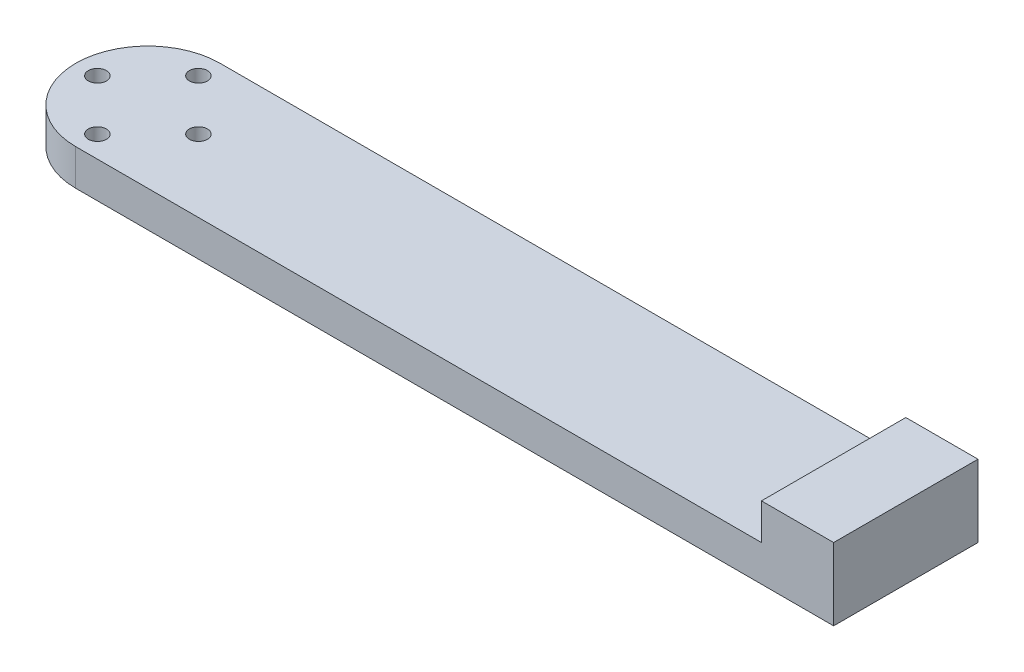
ISO-10303-21;
HEADER;
FILE_DESCRIPTION(('STEP AP214'),'2;1');
FILE_NAME('part.step','',(''),(''),'','','');
FILE_SCHEMA(('AUTOMOTIVE_DESIGN { 1 0 10303 214 1 1 1 1 }'));
ENDSEC;
DATA;
#1=APPLICATION_CONTEXT('core data for automotive mechanical design processes');
#2=APPLICATION_PROTOCOL_DEFINITION('international standard','automotive_design',2000,#1);
#3=PRODUCT_CONTEXT('',#1,'mechanical');
#4=PRODUCT('Part','Part','',(#3));
#5=PRODUCT_RELATED_PRODUCT_CATEGORY('part','',(#4));
#6=PRODUCT_DEFINITION_FORMATION('','',#4);
#7=PRODUCT_DEFINITION_CONTEXT('part definition',#1,'design');
#8=PRODUCT_DEFINITION('design','',#6,#7);
#9=PRODUCT_DEFINITION_SHAPE('','',#8);
#10=(LENGTH_UNIT() NAMED_UNIT(*) SI_UNIT(.MILLI.,.METRE.));
#11=(NAMED_UNIT(*) PLANE_ANGLE_UNIT() SI_UNIT($,.RADIAN.));
#12=(NAMED_UNIT(*) SI_UNIT($,.STERADIAN.) SOLID_ANGLE_UNIT());
#13=UNCERTAINTY_MEASURE_WITH_UNIT(LENGTH_MEASURE(1.E-05),#10,'distance_accuracy_value','');
#14=(GEOMETRIC_REPRESENTATION_CONTEXT(3) GLOBAL_UNCERTAINTY_ASSIGNED_CONTEXT((#13)) GLOBAL_UNIT_ASSIGNED_CONTEXT((#10,
#11,#12)) REPRESENTATION_CONTEXT('',''));
#15=CARTESIAN_POINT('',(0.,0.,0.));
#16=DIRECTION('',(0.,0.,1.));
#17=DIRECTION('',(1.,0.,0.));
#18=AXIS2_PLACEMENT_3D('',#15,#16,#17);
#19=CARTESIAN_POINT('',(0.,5.,0.));
#20=DIRECTION('',(0.,-1.,0.));
#21=DIRECTION('',(0.,0.,-1.));
#22=AXIS2_PLACEMENT_3D('',#19,#20,#21);
#23=CYLINDRICAL_SURFACE('',#22,10.);
#24=DIRECTION('',(0.,-1.,0.));
#25=VECTOR('',#24,1.);
#26=CARTESIAN_POINT('',(0.,111.88779163216,10.));
#27=LINE('',#26,#25);
#28=CARTESIAN_POINT('',(0.,5.,10.));
#29=VERTEX_POINT('',#28);
#30=CARTESIAN_POINT('',(0.,0.,10.));
#31=VERTEX_POINT('',#30);
#32=EDGE_CURVE('E138',#29,#31,#27,.T.);
#33=ORIENTED_EDGE('',*,*,#32,.F.);
#34=CARTESIAN_POINT('',(0.,5.,0.));
#35=DIRECTION('',(0.,1.,0.));
#36=DIRECTION('',(0.,0.,1.));
#37=AXIS2_PLACEMENT_3D('',#34,#35,#36);
#38=CIRCLE('',#37,10.);
#39=CARTESIAN_POINT('',(0.,5.,-10.));
#40=VERTEX_POINT('',#39);
#41=EDGE_CURVE('E122',#40,#29,#38,.T.);
#42=ORIENTED_EDGE('',*,*,#41,.F.);
#43=DIRECTION('',(0.,-1.,0.));
#44=VECTOR('',#43,1.);
#45=CARTESIAN_POINT('',(0.,111.88779163216,-10.));
#46=LINE('',#45,#44);
#47=CARTESIAN_POINT('',(0.,0.,-10.));
#48=VERTEX_POINT('',#47);
#49=EDGE_CURVE('E129',#40,#48,#46,.T.);
#50=ORIENTED_EDGE('',*,*,#49,.T.);
#51=CARTESIAN_POINT('',(0.,0.,0.));
#52=DIRECTION('',(0.,1.,0.));
#53=DIRECTION('',(0.,0.,1.));
#54=AXIS2_PLACEMENT_3D('',#51,#52,#53);
#55=CIRCLE('',#54,10.);
#56=EDGE_CURVE('E141',#48,#31,#55,.T.);
#57=ORIENTED_EDGE('',*,*,#56,.T.);
#58=EDGE_LOOP('',(#33,#42,#50,#57));
#59=FACE_BOUND('',#58,.T.);
#60=ADVANCED_FACE('F37',(#59),#23,.T.);
#61=CARTESIAN_POINT('',(0.,5.,0.));
#62=DIRECTION('',(0.,1.,0.));
#63=DIRECTION('',(0.,0.,1.));
#64=AXIS2_PLACEMENT_3D('',#61,#62,#63);
#65=PLANE('',#64);
#66=DIRECTION('',(0.,0.,1.));
#67=VECTOR('',#66,1.);
#68=CARTESIAN_POINT('',(95.,5.,0.));
#69=LINE('',#68,#67);
#70=CARTESIAN_POINT('',(95.,5.,-9.99999999999999));
#71=VERTEX_POINT('',#70);
#72=CARTESIAN_POINT('',(95.,5.,9.99999999999999));
#73=VERTEX_POINT('',#72);
#74=EDGE_CURVE('E123',#71,#73,#69,.T.);
#75=ORIENTED_EDGE('',*,*,#74,.F.);
#76=DIRECTION('',(-1.,0.,0.));
#77=VECTOR('',#76,1.);
#78=CARTESIAN_POINT('',(0.,5.,-10.));
#79=LINE('',#78,#77);
#80=EDGE_CURVE('E117',#71,#40,#79,.T.);
#81=ORIENTED_EDGE('',*,*,#80,.T.);
#82=ORIENTED_EDGE('',*,*,#41,.T.);
#83=DIRECTION('',(1.,0.,0.));
#84=VECTOR('',#83,1.);
#85=CARTESIAN_POINT('',(105.,5.,9.99999999999999));
#86=LINE('',#85,#84);
#87=EDGE_CURVE('E61',#29,#73,#86,.T.);
#88=ORIENTED_EDGE('',*,*,#87,.T.);
#89=EDGE_LOOP('',(#75,#81,#82,#88));
#90=FACE_BOUND('',#89,.T.);
#91=CARTESIAN_POINT('',(3.95332173747447E-13,5.,7.));
#92=DIRECTION('',(0.,1.,0.));
#93=DIRECTION('',(0.,0.,1.));
#94=AXIS2_PLACEMENT_3D('',#91,#92,#93);
#95=CIRCLE('',#94,1.25000000000042);
#96=CARTESIAN_POINT('',(3.95332173747447E-13,5.,8.25000000000042));
#97=VERTEX_POINT('',#96);
#98=EDGE_CURVE('E155',#97,#97,#95,.T.);
#99=ORIENTED_EDGE('',*,*,#98,.F.);
#100=EDGE_LOOP('',(#99));
#101=FACE_BOUND('',#100,.T.);
#102=CARTESIAN_POINT('',(0.,5.,-7.));
#103=DIRECTION('',(0.,1.,0.));
#104=DIRECTION('',(0.,0.,1.));
#105=AXIS2_PLACEMENT_3D('',#102,#103,#104);
#106=CIRCLE('',#105,1.25);
#107=CARTESIAN_POINT('',(0.,5.,-5.75));
#108=VERTEX_POINT('',#107);
#109=EDGE_CURVE('E144',#108,#108,#106,.T.);
#110=ORIENTED_EDGE('',*,*,#109,.F.);
#111=EDGE_LOOP('',(#110));
#112=FACE_BOUND('',#111,.T.);
#113=CARTESIAN_POINT('',(7.0000000000002,5.,-1.97666086873723E-13));
#114=DIRECTION('',(0.,1.,0.));
#115=DIRECTION('',(0.,0.,1.));
#116=AXIS2_PLACEMENT_3D('',#113,#114,#115);
#117=CIRCLE('',#116,1.25000000000015);
#118=CARTESIAN_POINT('',(7.0000000000002,5.,1.24999999999996));
#119=VERTEX_POINT('',#118);
#120=EDGE_CURVE('E149',#119,#119,#117,.T.);
#121=ORIENTED_EDGE('',*,*,#120,.F.);
#122=EDGE_LOOP('',(#121));
#123=FACE_BOUND('',#122,.T.);
#124=CARTESIAN_POINT('',(-6.9999999999998,5.,1.98523339633126E-13));
#125=DIRECTION('',(0.,1.,0.));
#126=DIRECTION('',(0.,0.,1.));
#127=AXIS2_PLACEMENT_3D('',#124,#125,#126);
#128=CIRCLE('',#127,1.25000000000032);
#129=CARTESIAN_POINT('',(-6.9999999999998,5.,1.25000000000052));
#130=VERTEX_POINT('',#129);
#131=EDGE_CURVE('E161',#130,#130,#128,.T.);
#132=ORIENTED_EDGE('',*,*,#131,.F.);
#133=EDGE_LOOP('',(#132));
#134=FACE_BOUND('',#133,.T.);
#135=ADVANCED_FACE('F119',(#90,#101,#112,#123,#134),#65,.T.);
#136=CARTESIAN_POINT('',(0.,0.,0.));
#137=DIRECTION('',(0.,1.,0.));
#138=DIRECTION('',(0.,0.,1.));
#139=AXIS2_PLACEMENT_3D('',#136,#137,#138);
#140=PLANE('',#139);
#141=DIRECTION('',(-1.,0.,0.));
#142=VECTOR('',#141,1.);
#143=CARTESIAN_POINT('',(0.,0.,-10.));
#144=LINE('',#143,#142);
#145=CARTESIAN_POINT('',(97.,0.,-9.99999999999999));
#146=VERTEX_POINT('',#145);
#147=EDGE_CURVE('E134',#146,#48,#144,.T.);
#148=ORIENTED_EDGE('',*,*,#147,.F.);
#149=DIRECTION('',(0.,0.,-1.));
#150=VECTOR('',#149,1.);
#151=CARTESIAN_POINT('',(97.,0.,-6.99999999999999));
#152=LINE('',#151,#150);
#153=CARTESIAN_POINT('',(97.,0.,-6.99999999999999));
#154=VERTEX_POINT('',#153);
#155=EDGE_CURVE('E203',#154,#146,#152,.T.);
#156=ORIENTED_EDGE('',*,*,#155,.F.);
#157=DIRECTION('',(-1.,0.,0.));
#158=VECTOR('',#157,1.);
#159=CARTESIAN_POINT('',(97.,0.,-6.99999999999999));
#160=LINE('',#159,#158);
#161=CARTESIAN_POINT('',(103.,0.,-6.99999999999999));
#162=VERTEX_POINT('',#161);
#163=EDGE_CURVE('E208',#162,#154,#160,.T.);
#164=ORIENTED_EDGE('',*,*,#163,.F.);
#165=DIRECTION('',(0.,0.,-1.));
#166=VECTOR('',#165,1.);
#167=CARTESIAN_POINT('',(103.,0.,-6.99999999999999));
#168=LINE('',#167,#166);
#169=CARTESIAN_POINT('',(103.,0.,-9.99999999999999));
#170=VERTEX_POINT('',#169);
#171=EDGE_CURVE('E210',#162,#170,#168,.T.);
#172=ORIENTED_EDGE('',*,*,#171,.T.);
#173=CARTESIAN_POINT('',(105.,0.,-9.99999999999999));
#174=VERTEX_POINT('',#173);
#175=EDGE_CURVE('E126',#174,#170,#144,.T.);
#176=ORIENTED_EDGE('',*,*,#175,.F.);
#177=DIRECTION('',(0.,0.,-1.));
#178=VECTOR('',#177,1.);
#179=CARTESIAN_POINT('',(105.,0.,-9.99999999999999));
#180=LINE('',#179,#178);
#181=CARTESIAN_POINT('',(105.,0.,9.99999999999999));
#182=VERTEX_POINT('',#181);
#183=EDGE_CURVE('E171',#182,#174,#180,.T.);
#184=ORIENTED_EDGE('',*,*,#183,.F.);
#185=DIRECTION('',(1.,0.,0.));
#186=VECTOR('',#185,1.);
#187=CARTESIAN_POINT('',(105.,0.,9.99999999999999));
#188=LINE('',#187,#186);
#189=EDGE_CURVE('E175',#31,#182,#188,.T.);
#190=ORIENTED_EDGE('',*,*,#189,.F.);
#191=ORIENTED_EDGE('',*,*,#56,.F.);
#192=EDGE_LOOP('',(#148,#156,#164,#172,#176,#184,#190,#191));
#193=FACE_BOUND('',#192,.T.);
#194=CARTESIAN_POINT('',(0.,0.,-7.));
#195=DIRECTION('',(0.,1.,0.));
#196=DIRECTION('',(0.,0.,1.));
#197=AXIS2_PLACEMENT_3D('',#194,#195,#196);
#198=CIRCLE('',#197,1.25);
#199=CARTESIAN_POINT('',(0.,0.,-5.75));
#200=VERTEX_POINT('',#199);
#201=EDGE_CURVE('E146',#200,#200,#198,.T.);
#202=ORIENTED_EDGE('',*,*,#201,.T.);
#203=EDGE_LOOP('',(#202));
#204=FACE_BOUND('',#203,.T.);
#205=CARTESIAN_POINT('',(7.0000000000002,0.,-1.97666086873723E-13));
#206=DIRECTION('',(0.,1.,0.));
#207=DIRECTION('',(0.,0.,1.));
#208=AXIS2_PLACEMENT_3D('',#205,#206,#207);
#209=CIRCLE('',#208,1.25000000000015);
#210=CARTESIAN_POINT('',(7.0000000000002,0.,1.24999999999996));
#211=VERTEX_POINT('',#210);
#212=EDGE_CURVE('E152',#211,#211,#209,.T.);
#213=ORIENTED_EDGE('',*,*,#212,.T.);
#214=EDGE_LOOP('',(#213));
#215=FACE_BOUND('',#214,.T.);
#216=CARTESIAN_POINT('',(3.95332173747447E-13,0.,7.));
#217=DIRECTION('',(0.,1.,0.));
#218=DIRECTION('',(0.,0.,1.));
#219=AXIS2_PLACEMENT_3D('',#216,#217,#218);
#220=CIRCLE('',#219,1.25000000000042);
#221=CARTESIAN_POINT('',(3.95332173747447E-13,0.,8.25000000000042));
#222=VERTEX_POINT('',#221);
#223=EDGE_CURVE('E158',#222,#222,#220,.T.);
#224=ORIENTED_EDGE('',*,*,#223,.T.);
#225=EDGE_LOOP('',(#224));
#226=FACE_BOUND('',#225,.T.);
#227=CARTESIAN_POINT('',(-6.9999999999998,0.,1.98523339633126E-13));
#228=DIRECTION('',(0.,1.,0.));
#229=DIRECTION('',(0.,0.,1.));
#230=AXIS2_PLACEMENT_3D('',#227,#228,#229);
#231=CIRCLE('',#230,1.25000000000032);
#232=CARTESIAN_POINT('',(-6.9999999999998,0.,1.25000000000052));
#233=VERTEX_POINT('',#232);
#234=EDGE_CURVE('E164',#233,#233,#231,.T.);
#235=ORIENTED_EDGE('',*,*,#234,.T.);
#236=EDGE_LOOP('',(#235));
#237=FACE_BOUND('',#236,.T.);
#238=ADVANCED_FACE('F230',(#193,#204,#215,#226,#237),#140,.F.);
#239=CARTESIAN_POINT('',(0.,5.,-7.));
#240=DIRECTION('',(0.,-1.,0.));
#241=DIRECTION('',(0.,0.,-1.));
#242=AXIS2_PLACEMENT_3D('',#239,#240,#241);
#243=CYLINDRICAL_SURFACE('',#242,1.25);
#244=ORIENTED_EDGE('',*,*,#109,.T.);
#245=EDGE_LOOP('',(#244));
#246=FACE_BOUND('',#245,.T.);
#247=ORIENTED_EDGE('',*,*,#201,.F.);
#248=EDGE_LOOP('',(#247));
#249=FACE_BOUND('',#248,.T.);
#250=ADVANCED_FACE('F254',(#246,#249),#243,.F.);
#251=CARTESIAN_POINT('',(7.0000000000002,5.,-1.97666086873723E-13));
#252=DIRECTION('',(0.,-1.,0.));
#253=DIRECTION('',(0.,0.,-1.));
#254=AXIS2_PLACEMENT_3D('',#251,#252,#253);
#255=CYLINDRICAL_SURFACE('',#254,1.25000000000015);
#256=ORIENTED_EDGE('',*,*,#120,.T.);
#257=EDGE_LOOP('',(#256));
#258=FACE_BOUND('',#257,.T.);
#259=ORIENTED_EDGE('',*,*,#212,.F.);
#260=EDGE_LOOP('',(#259));
#261=FACE_BOUND('',#260,.T.);
#262=ADVANCED_FACE('F258',(#258,#261),#255,.F.);
#263=CARTESIAN_POINT('',(3.95332173747447E-13,5.,7.));
#264=DIRECTION('',(0.,-1.,0.));
#265=DIRECTION('',(0.,0.,-1.));
#266=AXIS2_PLACEMENT_3D('',#263,#264,#265);
#267=CYLINDRICAL_SURFACE('',#266,1.25000000000042);
#268=ORIENTED_EDGE('',*,*,#98,.T.);
#269=EDGE_LOOP('',(#268));
#270=FACE_BOUND('',#269,.T.);
#271=ORIENTED_EDGE('',*,*,#223,.F.);
#272=EDGE_LOOP('',(#271));
#273=FACE_BOUND('',#272,.T.);
#274=ADVANCED_FACE('F262',(#270,#273),#267,.F.);
#275=CARTESIAN_POINT('',(-6.9999999999998,5.,1.98523339633126E-13));
#276=DIRECTION('',(0.,-1.,0.));
#277=DIRECTION('',(0.,0.,-1.));
#278=AXIS2_PLACEMENT_3D('',#275,#276,#277);
#279=CYLINDRICAL_SURFACE('',#278,1.25000000000032);
#280=ORIENTED_EDGE('',*,*,#131,.T.);
#281=EDGE_LOOP('',(#280));
#282=FACE_BOUND('',#281,.T.);
#283=ORIENTED_EDGE('',*,*,#234,.F.);
#284=EDGE_LOOP('',(#283));
#285=FACE_BOUND('',#284,.T.);
#286=ADVANCED_FACE('F266',(#282,#285),#279,.F.);
#287=CARTESIAN_POINT('',(105.,111.88779163216,9.99999999999999));
#288=DIRECTION('',(0.,0.,-1.));
#289=DIRECTION('',(-1.,0.,0.));
#290=AXIS2_PLACEMENT_3D('',#287,#288,#289);
#291=PLANE('',#290);
#292=ORIENTED_EDGE('',*,*,#189,.T.);
#293=DIRECTION('',(0.,-1.,0.));
#294=VECTOR('',#293,1.);
#295=CARTESIAN_POINT('',(105.,111.88779163216,9.99999999999999));
#296=LINE('',#295,#294);
#297=CARTESIAN_POINT('',(105.,10.,9.99999999999999));
#298=VERTEX_POINT('',#297);
#299=EDGE_CURVE('E172',#298,#182,#296,.T.);
#300=ORIENTED_EDGE('',*,*,#299,.F.);
#301=DIRECTION('',(-1.,0.,0.));
#302=VECTOR('',#301,1.);
#303=CARTESIAN_POINT('',(105.,10.,9.99999999999999));
#304=LINE('',#303,#302);
#305=CARTESIAN_POINT('',(95.,10.,9.99999999999999));
#306=VERTEX_POINT('',#305);
#307=EDGE_CURVE('E184',#298,#306,#304,.T.);
#308=ORIENTED_EDGE('',*,*,#307,.T.);
#309=DIRECTION('',(0.,-1.,0.));
#310=VECTOR('',#309,1.);
#311=CARTESIAN_POINT('',(95.,0.,9.99999999999999));
#312=LINE('',#311,#310);
#313=EDGE_CURVE('E192',#306,#73,#312,.T.);
#314=ORIENTED_EDGE('',*,*,#313,.T.);
#315=ORIENTED_EDGE('',*,*,#87,.F.);
#316=ORIENTED_EDGE('',*,*,#32,.T.);
#317=EDGE_LOOP('',(#292,#300,#308,#314,#315,#316));
#318=FACE_BOUND('',#317,.T.);
#319=ADVANCED_FACE('F270',(#318),#291,.F.);
#320=CARTESIAN_POINT('',(105.,111.88779163216,-9.99999999999999));
#321=DIRECTION('',(-1.,0.,0.));
#322=DIRECTION('',(0.,0.,1.));
#323=AXIS2_PLACEMENT_3D('',#320,#321,#322);
#324=PLANE('',#323);
#325=DIRECTION('',(0.,-1.,0.));
#326=VECTOR('',#325,1.);
#327=CARTESIAN_POINT('',(105.,111.88779163216,-9.99999999999999));
#328=LINE('',#327,#326);
#329=CARTESIAN_POINT('',(105.,10.,-9.99999999999999));
#330=VERTEX_POINT('',#329);
#331=EDGE_CURVE('E169',#330,#174,#328,.T.);
#332=ORIENTED_EDGE('',*,*,#331,.F.);
#333=DIRECTION('',(0.,0.,-1.));
#334=VECTOR('',#333,1.);
#335=CARTESIAN_POINT('',(105.,10.,24.1421356237309));
#336=LINE('',#335,#334);
#337=EDGE_CURVE('E188',#298,#330,#336,.T.);
#338=ORIENTED_EDGE('',*,*,#337,.F.);
#339=ORIENTED_EDGE('',*,*,#299,.T.);
#340=ORIENTED_EDGE('',*,*,#183,.T.);
#341=EDGE_LOOP('',(#332,#338,#339,#340));
#342=FACE_BOUND('',#341,.T.);
#343=ADVANCED_FACE('F274',(#342),#324,.F.);
#344=CARTESIAN_POINT('',(0.,111.88779163216,-10.));
#345=DIRECTION('',(0.,0.,1.));
#346=DIRECTION('',(1.,0.,0.));
#347=AXIS2_PLACEMENT_3D('',#344,#345,#346);
#348=PLANE('',#347);
#349=CARTESIAN_POINT('',(100.,5.,-9.99999999999999));
#350=DIRECTION('',(0.,0.,-1.));
#351=DIRECTION('',(-1.,0.,0.));
#352=AXIS2_PLACEMENT_3D('',#349,#350,#351);
#353=CIRCLE('',#352,3.00000000000001);
#354=CARTESIAN_POINT('',(97.,5.,-9.99999999999999));
#355=VERTEX_POINT('',#354);
#356=CARTESIAN_POINT('',(103.,5.,-9.99999999999999));
#357=VERTEX_POINT('',#356);
#358=EDGE_CURVE('E197',#355,#357,#353,.T.);
#359=ORIENTED_EDGE('',*,*,#358,.F.);
#360=DIRECTION('',(0.,1.,0.));
#361=VECTOR('',#360,1.);
#362=CARTESIAN_POINT('',(97.,5.,-9.99999999999999));
#363=LINE('',#362,#361);
#364=EDGE_CURVE('E216',#146,#355,#363,.T.);
#365=ORIENTED_EDGE('',*,*,#364,.F.);
#366=ORIENTED_EDGE('',*,*,#147,.T.);
#367=ORIENTED_EDGE('',*,*,#49,.F.);
#368=ORIENTED_EDGE('',*,*,#80,.F.);
#369=DIRECTION('',(0.,1.,0.));
#370=VECTOR('',#369,1.);
#371=CARTESIAN_POINT('',(95.,0.,-9.99999999999999));
#372=LINE('',#371,#370);
#373=CARTESIAN_POINT('',(95.,10.,-9.99999999999999));
#374=VERTEX_POINT('',#373);
#375=EDGE_CURVE('E195',#71,#374,#372,.T.);
#376=ORIENTED_EDGE('',*,*,#375,.T.);
#377=DIRECTION('',(1.,0.,0.));
#378=VECTOR('',#377,1.);
#379=CARTESIAN_POINT('',(105.,10.,-9.99999999999999));
#380=LINE('',#379,#378);
#381=EDGE_CURVE('E189',#374,#330,#380,.T.);
#382=ORIENTED_EDGE('',*,*,#381,.T.);
#383=ORIENTED_EDGE('',*,*,#331,.T.);
#384=ORIENTED_EDGE('',*,*,#175,.T.);
#385=DIRECTION('',(0.,-1.,0.));
#386=VECTOR('',#385,1.);
#387=CARTESIAN_POINT('',(103.,5.,-9.99999999999999));
#388=LINE('',#387,#386);
#389=EDGE_CURVE('E214',#357,#170,#388,.T.);
#390=ORIENTED_EDGE('',*,*,#389,.F.);
#391=EDGE_LOOP('',(#359,#365,#366,#367,#368,#376,#382,#383,#384,#390));
#392=FACE_BOUND('',#391,.T.);
#393=ADVANCED_FACE('F131',(#392),#348,.F.);
#394=CARTESIAN_POINT('',(105.,10.,24.1421356237309));
#395=DIRECTION('',(0.,1.,0.));
#396=DIRECTION('',(0.,0.,1.));
#397=AXIS2_PLACEMENT_3D('',#394,#395,#396);
#398=PLANE('',#397);
#399=ORIENTED_EDGE('',*,*,#307,.F.);
#400=ORIENTED_EDGE('',*,*,#337,.T.);
#401=ORIENTED_EDGE('',*,*,#381,.F.);
#402=DIRECTION('',(0.,0.,-1.));
#403=VECTOR('',#402,1.);
#404=CARTESIAN_POINT('',(95.,10.,24.1421356237309));
#405=LINE('',#404,#403);
#406=EDGE_CURVE('E185',#306,#374,#405,.T.);
#407=ORIENTED_EDGE('',*,*,#406,.F.);
#408=EDGE_LOOP('',(#399,#400,#401,#407));
#409=FACE_BOUND('',#408,.T.);
#410=ADVANCED_FACE('F281',(#409),#398,.T.);
#411=CARTESIAN_POINT('',(95.,0.,24.1421356237309));
#412=DIRECTION('',(-1.,0.,0.));
#413=DIRECTION('',(0.,0.,1.));
#414=AXIS2_PLACEMENT_3D('',#411,#412,#413);
#415=PLANE('',#414);
#416=ORIENTED_EDGE('',*,*,#375,.F.);
#417=ORIENTED_EDGE('',*,*,#74,.T.);
#418=ORIENTED_EDGE('',*,*,#313,.F.);
#419=ORIENTED_EDGE('',*,*,#406,.T.);
#420=EDGE_LOOP('',(#416,#417,#418,#419));
#421=FACE_BOUND('',#420,.T.);
#422=ADVANCED_FACE('F245',(#421),#415,.T.);
#423=CARTESIAN_POINT('',(100.,5.,-3.99999999999999));
#424=DIRECTION('',(0.,0.,-1.));
#425=DIRECTION('',(-1.,0.,0.));
#426=AXIS2_PLACEMENT_3D('',#423,#424,#425);
#427=CYLINDRICAL_SURFACE('',#426,3.00000000000001);
#428=ORIENTED_EDGE('',*,*,#358,.T.);
#429=DIRECTION('',(0.,0.,-1.));
#430=VECTOR('',#429,1.);
#431=CARTESIAN_POINT('',(103.,5.,-6.99999999999999));
#432=LINE('',#431,#430);
#433=CARTESIAN_POINT('',(103.,5.,-6.99999999999999));
#434=VERTEX_POINT('',#433);
#435=EDGE_CURVE('E207',#434,#357,#432,.T.);
#436=ORIENTED_EDGE('',*,*,#435,.F.);
#437=CARTESIAN_POINT('',(100.,5.,-6.99999999999998));
#438=DIRECTION('',(0.,0.,-1.));
#439=DIRECTION('',(-1.,0.,0.));
#440=AXIS2_PLACEMENT_3D('',#437,#438,#439);
#441=CIRCLE('',#440,3.00000000000001);
#442=CARTESIAN_POINT('',(97.,5.,-6.99999999999998));
#443=VERTEX_POINT('',#442);
#444=EDGE_CURVE('E46',#434,#443,#441,.F.);
#445=ORIENTED_EDGE('',*,*,#444,.T.);
#446=DIRECTION('',(0.,0.,-1.));
#447=VECTOR('',#446,1.);
#448=CARTESIAN_POINT('',(97.,5.,-6.99999999999999));
#449=LINE('',#448,#447);
#450=EDGE_CURVE('E204',#443,#355,#449,.T.);
#451=ORIENTED_EDGE('',*,*,#450,.T.);
#452=EDGE_LOOP('',(#428,#436,#445,#451));
#453=FACE_BOUND('',#452,.T.);
#454=ADVANCED_FACE('F236',(#453),#427,.F.);
#455=CARTESIAN_POINT('',(100.,5.,-6.99999999999998));
#456=DIRECTION('',(0.,0.,-1.));
#457=DIRECTION('',(-1.,0.,0.));
#458=AXIS2_PLACEMENT_3D('',#455,#456,#457);
#459=CONICAL_SURFACE('',#458,3.00000000000003,0.785398163397456);
#460=EDGE_CURVE('E11',#443,#434,#441,.F.);
#461=ORIENTED_EDGE('',*,*,#460,.F.);
#462=ORIENTED_EDGE('',*,*,#444,.F.);
#463=EDGE_LOOP('',(#461,#462));
#464=FACE_BOUND('',#463,.T.);
#465=CARTESIAN_POINT('',(100.,5.,-3.99999999999999));
#466=VERTEX_POINT('',#465);
#467=VERTEX_LOOP('',#466);
#468=FACE_BOUND('',#467,.T.);
#469=ADVANCED_FACE('F40',(#464,#468),#459,.F.);
#470=CARTESIAN_POINT('',(0.,0.,-7.00000000000002));
#471=DIRECTION('',(0.,0.,1.));
#472=DIRECTION('',(1.,0.,0.));
#473=AXIS2_PLACEMENT_3D('',#470,#471,#472);
#474=PLANE('',#473);
#475=DIRECTION('',(0.,-1.,0.));
#476=VECTOR('',#475,1.);
#477=CARTESIAN_POINT('',(103.,5.,-6.99999999999999));
#478=LINE('',#477,#476);
#479=EDGE_CURVE('E219',#434,#162,#478,.T.);
#480=ORIENTED_EDGE('',*,*,#479,.T.);
#481=ORIENTED_EDGE('',*,*,#163,.T.);
#482=DIRECTION('',(0.,1.,0.));
#483=VECTOR('',#482,1.);
#484=CARTESIAN_POINT('',(97.,5.,-6.99999999999999));
#485=LINE('',#484,#483);
#486=EDGE_CURVE('E52',#154,#443,#485,.T.);
#487=ORIENTED_EDGE('',*,*,#486,.T.);
#488=ORIENTED_EDGE('',*,*,#460,.T.);
#489=EDGE_LOOP('',(#480,#481,#487,#488));
#490=FACE_BOUND('',#489,.T.);
#491=ADVANCED_FACE('F224',(#490),#474,.F.);
#492=CARTESIAN_POINT('',(97.,5.,-6.99999999999999));
#493=DIRECTION('',(-1.,0.,0.));
#494=DIRECTION('',(0.,0.,1.));
#495=AXIS2_PLACEMENT_3D('',#492,#493,#494);
#496=PLANE('',#495);
#497=ORIENTED_EDGE('',*,*,#364,.T.);
#498=ORIENTED_EDGE('',*,*,#450,.F.);
#499=ORIENTED_EDGE('',*,*,#486,.F.);
#500=ORIENTED_EDGE('',*,*,#155,.T.);
#501=EDGE_LOOP('',(#497,#498,#499,#500));
#502=FACE_BOUND('',#501,.T.);
#503=ADVANCED_FACE('F233',(#502),#496,.F.);
#504=CARTESIAN_POINT('',(103.,5.,-6.99999999999999));
#505=DIRECTION('',(1.,0.,0.));
#506=DIRECTION('',(0.,0.,-1.));
#507=AXIS2_PLACEMENT_3D('',#504,#505,#506);
#508=PLANE('',#507);
#509=ORIENTED_EDGE('',*,*,#389,.T.);
#510=ORIENTED_EDGE('',*,*,#171,.F.);
#511=ORIENTED_EDGE('',*,*,#479,.F.);
#512=ORIENTED_EDGE('',*,*,#435,.T.);
#513=EDGE_LOOP('',(#509,#510,#511,#512));
#514=FACE_BOUND('',#513,.T.);
#515=ADVANCED_FACE('F290',(#514),#508,.F.);
#516=CLOSED_SHELL('',(#60,#135,#238,#250,#262,#274,#286,#319,#343,#393,#410,#422,#454,#469,#491,
#503,#515));
#517=MANIFOLD_SOLID_BREP('B2',#516);
#518=ADVANCED_BREP_SHAPE_REPRESENTATION('',(#18,#517),#14);
#519=SHAPE_DEFINITION_REPRESENTATION(#9,#518);
ENDSEC;
END-ISO-10303-21;
